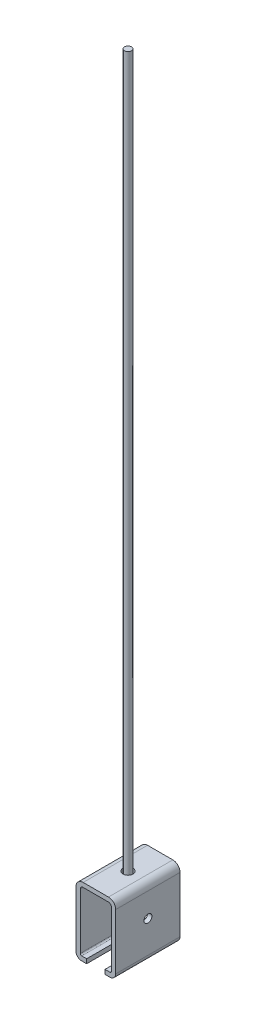
ISO-10303-21;
HEADER;
FILE_DESCRIPTION(('STEP AP214'),'2;1');
FILE_NAME('part.step','',(''),(''),'','','');
FILE_SCHEMA(('AUTOMOTIVE_DESIGN { 1 0 10303 214 1 1 1 1 }'));
ENDSEC;
DATA;
#1=APPLICATION_CONTEXT('core data for automotive mechanical design processes');
#2=APPLICATION_PROTOCOL_DEFINITION('international standard','automotive_design',2000,#1);
#3=PRODUCT_CONTEXT('',#1,'mechanical');
#4=PRODUCT('Part','Part','',(#3));
#5=PRODUCT_RELATED_PRODUCT_CATEGORY('part','',(#4));
#6=PRODUCT_DEFINITION_FORMATION('','',#4);
#7=PRODUCT_DEFINITION_CONTEXT('part definition',#1,'design');
#8=PRODUCT_DEFINITION('design','',#6,#7);
#9=PRODUCT_DEFINITION_SHAPE('','',#8);
#10=(LENGTH_UNIT() NAMED_UNIT(*) SI_UNIT(.MILLI.,.METRE.));
#11=(NAMED_UNIT(*) PLANE_ANGLE_UNIT() SI_UNIT($,.RADIAN.));
#12=(NAMED_UNIT(*) SI_UNIT($,.STERADIAN.) SOLID_ANGLE_UNIT());
#13=UNCERTAINTY_MEASURE_WITH_UNIT(LENGTH_MEASURE(1.E-05),#10,'distance_accuracy_value','');
#14=(GEOMETRIC_REPRESENTATION_CONTEXT(3) GLOBAL_UNCERTAINTY_ASSIGNED_CONTEXT((#13)) GLOBAL_UNIT_ASSIGNED_CONTEXT((#10,
#11,#12)) REPRESENTATION_CONTEXT('',''));
#15=CARTESIAN_POINT('',(0.,0.,0.));
#16=DIRECTION('',(0.,0.,1.));
#17=DIRECTION('',(1.,0.,0.));
#18=AXIS2_PLACEMENT_3D('',#15,#16,#17);
#19=CARTESIAN_POINT('',(0.,76.2999999999998,44.5));
#20=DIRECTION('',(0.,1.,0.));
#21=DIRECTION('',(-1.,0.,0.));
#22=AXIS2_PLACEMENT_3D('',#19,#20,#21);
#23=CYLINDRICAL_SURFACE('',#22,4.7625);
#24=CARTESIAN_POINT('',(0.,76.2999999999998,44.5));
#25=DIRECTION('',(0.,-1.,0.));
#26=DIRECTION('',(1.,0.,0.));
#27=AXIS2_PLACEMENT_3D('',#24,#25,#26);
#28=CIRCLE('',#27,4.7625);
#29=CARTESIAN_POINT('',(4.7625,76.2999999999998,44.5));
#30=VERTEX_POINT('',#29);
#31=EDGE_CURVE('P0_E10',#30,#30,#28,.T.);
#32=ORIENTED_EDGE('',*,*,#31,.F.);
#33=EDGE_LOOP('',(#32));
#34=FACE_BOUND('',#33,.T.);
#35=CARTESIAN_POINT('',(1.33226762955019E-12,1079.6,44.5));
#36=DIRECTION('',(0.,-1.,0.));
#37=DIRECTION('',(1.,0.,0.));
#38=AXIS2_PLACEMENT_3D('',#35,#36,#37);
#39=CIRCLE('',#38,4.7625);
#40=CARTESIAN_POINT('',(4.76250000000133,1079.6,44.5));
#41=VERTEX_POINT('',#40);
#42=EDGE_CURVE('P0_E36',#41,#41,#39,.T.);
#43=ORIENTED_EDGE('',*,*,#42,.T.);
#44=EDGE_LOOP('',(#43));
#45=FACE_BOUND('',#44,.T.);
#46=ADVANCED_FACE('P0_F30',(#34,#45),#23,.T.);
#47=CARTESIAN_POINT('',(0.,76.2999999999998,44.5));
#48=DIRECTION('',(0.,-1.,0.));
#49=DIRECTION('',(1.,0.,0.));
#50=AXIS2_PLACEMENT_3D('',#47,#48,#49);
#51=PLANE('',#50);
#52=ORIENTED_EDGE('',*,*,#31,.T.);
#53=EDGE_LOOP('',(#52));
#54=FACE_BOUND('',#53,.T.);
#55=ADVANCED_FACE('P0_F45',(#54),#51,.T.);
#56=CARTESIAN_POINT('',(1.33226762955019E-12,1079.6,44.5));
#57=DIRECTION('',(0.,-1.,0.));
#58=DIRECTION('',(1.,0.,0.));
#59=AXIS2_PLACEMENT_3D('',#56,#57,#58);
#60=PLANE('',#59);
#61=ORIENTED_EDGE('',*,*,#42,.F.);
#62=EDGE_LOOP('',(#61));
#63=FACE_BOUND('',#62,.T.);
#64=ADVANCED_FACE('P0_F43',(#63),#60,.F.);
#65=CLOSED_SHELL('',(#46,#55,#64));
#66=MANIFOLD_SOLID_BREP('P0_B2',#65);
#67=CARTESIAN_POINT('',(-27.5,52.,44.5000000000001));
#68=DIRECTION('',(-1.,0.,0.));
#69=DIRECTION('',(0.,-1.,0.));
#70=AXIS2_PLACEMENT_3D('',#67,#68,#69);
#71=CYLINDRICAL_SURFACE('',#70,5.5);
#72=CARTESIAN_POINT('',(-27.5,52.,44.5000000000001));
#73=DIRECTION('',(-1.,0.,0.));
#74=DIRECTION('',(0.,-1.,0.));
#75=AXIS2_PLACEMENT_3D('',#72,#73,#74);
#76=CIRCLE('',#75,5.5);
#77=CARTESIAN_POINT('',(-27.5,46.5,44.5000000000001));
#78=VERTEX_POINT('',#77);
#79=EDGE_CURVE('P1_E207',#78,#78,#76,.F.);
#80=ORIENTED_EDGE('',*,*,#79,.F.);
#81=EDGE_LOOP('',(#80));
#82=FACE_BOUND('',#81,.T.);
#83=CARTESIAN_POINT('',(-21.5,52.,44.5000000000001));
#84=DIRECTION('',(-1.,0.,0.));
#85=DIRECTION('',(0.,-1.,0.));
#86=AXIS2_PLACEMENT_3D('',#83,#84,#85);
#87=CIRCLE('',#86,5.5);
#88=CARTESIAN_POINT('',(-21.5,46.5,44.5000000000001));
#89=VERTEX_POINT('',#88);
#90=EDGE_CURVE('P1_E203',#89,#89,#87,.T.);
#91=ORIENTED_EDGE('',*,*,#90,.F.);
#92=EDGE_LOOP('',(#91));
#93=FACE_BOUND('',#92,.T.);
#94=ADVANCED_FACE('P1_F17',(#82,#93),#71,.F.);
#95=CARTESIAN_POINT('',(-19.5000000000001,7.99999999999995,44.5000000000001));
#96=DIRECTION('',(0.,0.,-1.));
#97=DIRECTION('',(-1.,0.,0.));
#98=AXIS2_PLACEMENT_3D('',#95,#96,#97);
#99=CYLINDRICAL_SURFACE('',#98,2.);
#100=CARTESIAN_POINT('',(-19.5000000000001,7.99999999999995,0.));
#101=DIRECTION('',(0.,0.,-1.));
#102=DIRECTION('',(-1.,0.,0.));
#103=AXIS2_PLACEMENT_3D('',#100,#101,#102);
#104=CIRCLE('',#103,2.);
#105=CARTESIAN_POINT('',(-21.5000000000001,7.99999999999995,0.));
#106=VERTEX_POINT('',#105);
#107=CARTESIAN_POINT('',(-19.5000000000001,5.99999999999995,0.));
#108=VERTEX_POINT('',#107);
#109=EDGE_CURVE('P1_E216',#106,#108,#104,.F.);
#110=ORIENTED_EDGE('',*,*,#109,.F.);
#111=DIRECTION('',(0.,0.,1.));
#112=VECTOR('',#111,1.);
#113=CARTESIAN_POINT('',(-21.5000000000001,7.99999999999995,44.5000000000001));
#114=LINE('',#113,#112);
#115=CARTESIAN_POINT('',(-21.5000000000001,7.99999999999995,89.0000000000001));
#116=VERTEX_POINT('',#115);
#117=EDGE_CURVE('P1_E206',#116,#106,#114,.F.);
#118=ORIENTED_EDGE('',*,*,#117,.F.);
#119=CARTESIAN_POINT('',(-19.5000000000001,7.99999999999995,89.0000000000001));
#120=DIRECTION('',(0.,0.,-1.));
#121=DIRECTION('',(-1.,0.,0.));
#122=AXIS2_PLACEMENT_3D('',#119,#120,#121);
#123=CIRCLE('',#122,2.);
#124=CARTESIAN_POINT('',(-19.5000000000001,5.99999999999995,89.0000000000001));
#125=VERTEX_POINT('',#124);
#126=EDGE_CURVE('P1_E20',#125,#116,#123,.T.);
#127=ORIENTED_EDGE('',*,*,#126,.F.);
#128=DIRECTION('',(0.,0.,1.));
#129=VECTOR('',#128,1.);
#130=CARTESIAN_POINT('',(-19.5000000000001,5.99999999999996,44.5000000000001));
#131=LINE('',#130,#129);
#132=EDGE_CURVE('P1_E310',#108,#125,#131,.T.);
#133=ORIENTED_EDGE('',*,*,#132,.F.);
#134=EDGE_LOOP('',(#110,#118,#127,#133));
#135=FACE_BOUND('',#134,.T.);
#136=ADVANCED_FACE('P1_F229',(#135),#99,.F.);
#137=CARTESIAN_POINT('',(0.,88.9999999999998,44.5000000000001));
#138=DIRECTION('',(0.,-1.,0.));
#139=DIRECTION('',(1.,0.,0.));
#140=AXIS2_PLACEMENT_3D('',#137,#138,#139);
#141=CYLINDRICAL_SURFACE('',#140,6.99999999999999);
#142=CARTESIAN_POINT('',(0.,95.,44.5000000000001));
#143=DIRECTION('',(0.,-1.,0.));
#144=DIRECTION('',(1.,0.,0.));
#145=AXIS2_PLACEMENT_3D('',#142,#143,#144);
#146=CIRCLE('',#145,6.99999999999999);
#147=CARTESIAN_POINT('',(6.99999999999999,95.,44.5000000000001));
#148=VERTEX_POINT('',#147);
#149=EDGE_CURVE('P1_E164',#148,#148,#146,.T.);
#150=ORIENTED_EDGE('',*,*,#149,.F.);
#151=EDGE_LOOP('',(#150));
#152=FACE_BOUND('',#151,.T.);
#153=CARTESIAN_POINT('',(0.,88.9999999999999,44.5000000000001));
#154=DIRECTION('',(0.,-1.,0.));
#155=DIRECTION('',(1.,0.,0.));
#156=AXIS2_PLACEMENT_3D('',#153,#154,#155);
#157=CIRCLE('',#156,6.99999999999999);
#158=CARTESIAN_POINT('',(6.99999999999998,88.9999999999998,44.5000000000001));
#159=VERTEX_POINT('',#158);
#160=EDGE_CURVE('P1_E198',#159,#159,#157,.F.);
#161=ORIENTED_EDGE('',*,*,#160,.F.);
#162=EDGE_LOOP('',(#161));
#163=FACE_BOUND('',#162,.T.);
#164=ADVANCED_FACE('P1_F593',(#152,#163),#141,.F.);
#165=CARTESIAN_POINT('',(19.4999999999999,7.99999999999993,44.5000000000001));
#166=DIRECTION('',(0.,0.,-1.));
#167=DIRECTION('',(-1.,0.,0.));
#168=AXIS2_PLACEMENT_3D('',#165,#166,#167);
#169=CYLINDRICAL_SURFACE('',#168,2.);
#170=CARTESIAN_POINT('',(19.4999999999999,7.99999999999993,89.0000000000001));
#171=DIRECTION('',(0.,0.,-1.));
#172=DIRECTION('',(-1.,0.,0.));
#173=AXIS2_PLACEMENT_3D('',#170,#171,#172);
#174=CIRCLE('',#173,2.);
#175=CARTESIAN_POINT('',(21.4999999999999,7.99999999999993,89.0000000000001));
#176=VERTEX_POINT('',#175);
#177=CARTESIAN_POINT('',(19.4999999999999,5.99999999999993,89.0000000000001));
#178=VERTEX_POINT('',#177);
#179=EDGE_CURVE('P1_E213',#176,#178,#174,.T.);
#180=ORIENTED_EDGE('',*,*,#179,.F.);
#181=DIRECTION('',(0.,0.,1.));
#182=VECTOR('',#181,1.);
#183=CARTESIAN_POINT('',(21.4999999999999,7.99999999999992,44.5000000000001));
#184=LINE('',#183,#182);
#185=CARTESIAN_POINT('',(21.4999999999999,7.99999999999993,0.));
#186=VERTEX_POINT('',#185);
#187=EDGE_CURVE('P1_E285',#186,#176,#184,.T.);
#188=ORIENTED_EDGE('',*,*,#187,.F.);
#189=CARTESIAN_POINT('',(19.4999999999999,7.99999999999993,0.));
#190=DIRECTION('',(0.,0.,-1.));
#191=DIRECTION('',(-1.,0.,0.));
#192=AXIS2_PLACEMENT_3D('',#189,#190,#191);
#193=CIRCLE('',#192,2.);
#194=CARTESIAN_POINT('',(19.4999999999999,5.99999999999993,0.));
#195=VERTEX_POINT('',#194);
#196=EDGE_CURVE('P1_E215',#195,#186,#193,.F.);
#197=ORIENTED_EDGE('',*,*,#196,.F.);
#198=DIRECTION('',(0.,0.,1.));
#199=VECTOR('',#198,1.);
#200=CARTESIAN_POINT('',(19.4999999999999,5.99999999999993,44.5000000000001));
#201=LINE('',#200,#199);
#202=EDGE_CURVE('P1_E297',#178,#195,#201,.F.);
#203=ORIENTED_EDGE('',*,*,#202,.F.);
#204=EDGE_LOOP('',(#180,#188,#197,#203));
#205=FACE_BOUND('',#204,.T.);
#206=ADVANCED_FACE('P1_F584',(#205),#169,.F.);
#207=CARTESIAN_POINT('',(27.5,95.,44.5000000000001));
#208=DIRECTION('',(0.,1.,0.));
#209=DIRECTION('',(-1.,0.,0.));
#210=AXIS2_PLACEMENT_3D('',#207,#208,#209);
#211=PLANE('',#210);
#212=DIRECTION('',(0.,0.,1.));
#213=VECTOR('',#212,1.);
#214=CARTESIAN_POINT('',(17.5,95.,44.5000000000001));
#215=LINE('',#214,#213);
#216=CARTESIAN_POINT('',(17.5,95.,89.0000000000001));
#217=VERTEX_POINT('',#216);
#218=CARTESIAN_POINT('',(17.5,95.,0.));
#219=VERTEX_POINT('',#218);
#220=EDGE_CURVE('P1_E156',#217,#219,#215,.F.);
#221=ORIENTED_EDGE('',*,*,#220,.T.);
#222=DIRECTION('',(1.,0.,0.));
#223=VECTOR('',#222,1.);
#224=CARTESIAN_POINT('',(0.,95.,0.));
#225=LINE('',#224,#223);
#226=CARTESIAN_POINT('',(-17.5,94.9999999999999,0.));
#227=VERTEX_POINT('',#226);
#228=EDGE_CURVE('P1_E197',#219,#227,#225,.F.);
#229=ORIENTED_EDGE('',*,*,#228,.T.);
#230=DIRECTION('',(0.,0.,-1.));
#231=VECTOR('',#230,1.);
#232=CARTESIAN_POINT('',(-17.5,94.9999999999998,44.5000000000001));
#233=LINE('',#232,#231);
#234=CARTESIAN_POINT('',(-17.5,94.9999999999999,89.0000000000001));
#235=VERTEX_POINT('',#234);
#236=EDGE_CURVE('P1_E163',#235,#227,#233,.T.);
#237=ORIENTED_EDGE('',*,*,#236,.F.);
#238=DIRECTION('',(1.,0.,0.));
#239=VECTOR('',#238,1.);
#240=CARTESIAN_POINT('',(0.,95.,89.0000000000001));
#241=LINE('',#240,#239);
#242=EDGE_CURVE('P1_E167',#217,#235,#241,.F.);
#243=ORIENTED_EDGE('',*,*,#242,.F.);
#244=EDGE_LOOP('',(#221,#229,#237,#243));
#245=FACE_BOUND('',#244,.T.);
#246=ORIENTED_EDGE('',*,*,#149,.T.);
#247=EDGE_LOOP('',(#246));
#248=FACE_BOUND('',#247,.T.);
#249=ADVANCED_FACE('P1_F168',(#245,#248),#211,.T.);
#250=CARTESIAN_POINT('',(-17.5,84.9999999999998,44.5000000000001));
#251=DIRECTION('',(0.,0.,-1.));
#252=DIRECTION('',(-1.,0.,0.));
#253=AXIS2_PLACEMENT_3D('',#250,#251,#252);
#254=CYLINDRICAL_SURFACE('',#253,10.);
#255=DIRECTION('',(0.,0.,1.));
#256=VECTOR('',#255,1.);
#257=CARTESIAN_POINT('',(-27.5,84.9999999999998,44.5000000000001));
#258=LINE('',#257,#256);
#259=CARTESIAN_POINT('',(-27.5,84.9999999999998,89.0000000000001));
#260=VERTEX_POINT('',#259);
#261=CARTESIAN_POINT('',(-27.5,84.9999999999998,0.));
#262=VERTEX_POINT('',#261);
#263=EDGE_CURVE('P1_E210',#260,#262,#258,.F.);
#264=ORIENTED_EDGE('',*,*,#263,.F.);
#265=CARTESIAN_POINT('',(-17.5,84.9999999999998,89.0000000000001));
#266=DIRECTION('',(0.,0.,-1.));
#267=DIRECTION('',(-1.,0.,0.));
#268=AXIS2_PLACEMENT_3D('',#265,#266,#267);
#269=CIRCLE('',#268,10.);
#270=EDGE_CURVE('P1_E153',#235,#260,#269,.F.);
#271=ORIENTED_EDGE('',*,*,#270,.F.);
#272=ORIENTED_EDGE('',*,*,#236,.T.);
#273=CARTESIAN_POINT('',(-17.5,84.9999999999998,0.));
#274=DIRECTION('',(0.,0.,-1.));
#275=DIRECTION('',(-1.,0.,0.));
#276=AXIS2_PLACEMENT_3D('',#273,#274,#275);
#277=CIRCLE('',#276,10.);
#278=EDGE_CURVE('P1_E195',#227,#262,#277,.F.);
#279=ORIENTED_EDGE('',*,*,#278,.T.);
#280=EDGE_LOOP('',(#264,#271,#272,#279));
#281=FACE_BOUND('',#280,.T.);
#282=ADVANCED_FACE('P1_F567',(#281),#254,.T.);
#283=CARTESIAN_POINT('',(-27.5,95.,44.5000000000001));
#284=DIRECTION('',(-1.,0.,0.));
#285=DIRECTION('',(0.,-1.,0.));
#286=AXIS2_PLACEMENT_3D('',#283,#284,#285);
#287=PLANE('',#286);
#288=ORIENTED_EDGE('',*,*,#263,.T.);
#289=DIRECTION('',(0.,1.,0.));
#290=VECTOR('',#289,1.);
#291=CARTESIAN_POINT('',(-27.5,50.8643803585347,0.));
#292=LINE('',#291,#290);
#293=CARTESIAN_POINT('',(-27.5,7.99999999999998,0.));
#294=VERTEX_POINT('',#293);
#295=EDGE_CURVE('P1_E194',#262,#294,#292,.F.);
#296=ORIENTED_EDGE('',*,*,#295,.T.);
#297=DIRECTION('',(0.,0.,-1.));
#298=VECTOR('',#297,1.);
#299=CARTESIAN_POINT('',(-27.5000000000001,7.99999999999998,44.5000000000001));
#300=LINE('',#299,#298);
#301=CARTESIAN_POINT('',(-27.5,7.99999999999998,89.0000000000001));
#302=VERTEX_POINT('',#301);
#303=EDGE_CURVE('P1_E320',#302,#294,#300,.T.);
#304=ORIENTED_EDGE('',*,*,#303,.F.);
#305=DIRECTION('',(0.,1.,0.));
#306=VECTOR('',#305,1.);
#307=CARTESIAN_POINT('',(-27.5,50.8643803585347,89.0000000000001));
#308=LINE('',#307,#306);
#309=EDGE_CURVE('P1_E250',#260,#302,#308,.F.);
#310=ORIENTED_EDGE('',*,*,#309,.F.);
#311=EDGE_LOOP('',(#288,#296,#304,#310));
#312=FACE_BOUND('',#311,.T.);
#313=ORIENTED_EDGE('',*,*,#79,.T.);
#314=EDGE_LOOP('',(#313));
#315=FACE_BOUND('',#314,.T.);
#316=ADVANCED_FACE('P1_F343',(#312,#315),#287,.T.);
#317=CARTESIAN_POINT('',(-19.5000000000001,7.99999999999998,44.5000000000001));
#318=DIRECTION('',(0.,0.,-1.));
#319=DIRECTION('',(-1.,0.,0.));
#320=AXIS2_PLACEMENT_3D('',#317,#318,#319);
#321=CYLINDRICAL_SURFACE('',#320,8.);
#322=DIRECTION('',(0.,0.,1.));
#323=VECTOR('',#322,1.);
#324=CARTESIAN_POINT('',(-19.5000000000001,0.,44.5000000000001));
#325=LINE('',#324,#323);
#326=CARTESIAN_POINT('',(-19.5000000000001,0.,89.0000000000001));
#327=VERTEX_POINT('',#326);
#328=CARTESIAN_POINT('',(-19.5000000000001,0.,0.));
#329=VERTEX_POINT('',#328);
#330=EDGE_CURVE('P1_E317',#327,#329,#325,.F.);
#331=ORIENTED_EDGE('',*,*,#330,.F.);
#332=CARTESIAN_POINT('',(-19.5000000000001,7.99999999999998,89.0000000000001));
#333=DIRECTION('',(0.,0.,-1.));
#334=DIRECTION('',(-1.,0.,0.));
#335=AXIS2_PLACEMENT_3D('',#332,#333,#334);
#336=CIRCLE('',#335,8.);
#337=EDGE_CURVE('P1_E249',#302,#327,#336,.F.);
#338=ORIENTED_EDGE('',*,*,#337,.F.);
#339=ORIENTED_EDGE('',*,*,#303,.T.);
#340=CARTESIAN_POINT('',(-19.5000000000001,7.99999999999998,0.));
#341=DIRECTION('',(0.,0.,-1.));
#342=DIRECTION('',(-1.,0.,0.));
#343=AXIS2_PLACEMENT_3D('',#340,#341,#342);
#344=CIRCLE('',#343,8.);
#345=EDGE_CURVE('P1_E191',#294,#329,#344,.F.);
#346=ORIENTED_EDGE('',*,*,#345,.T.);
#347=EDGE_LOOP('',(#331,#338,#339,#346));
#348=FACE_BOUND('',#347,.T.);
#349=ADVANCED_FACE('P1_F341',(#348),#321,.T.);
#350=CARTESIAN_POINT('',(-27.5,0.,44.5000000000001));
#351=DIRECTION('',(0.,-1.,0.));
#352=DIRECTION('',(1.,0.,0.));
#353=AXIS2_PLACEMENT_3D('',#350,#351,#352);
#354=PLANE('',#353);
#355=DIRECTION('',(0.,0.,1.));
#356=VECTOR('',#355,1.);
#357=CARTESIAN_POINT('',(-12.7000000000001,0.,44.5000000000001));
#358=LINE('',#357,#356);
#359=CARTESIAN_POINT('',(-12.7000000000001,0.,89.0000000000001));
#360=VERTEX_POINT('',#359);
#361=CARTESIAN_POINT('',(-12.7000000000001,0.,0.));
#362=VERTEX_POINT('',#361);
#363=EDGE_CURVE('P1_E312',#360,#362,#358,.F.);
#364=ORIENTED_EDGE('',*,*,#363,.F.);
#365=DIRECTION('',(1.,0.,0.));
#366=VECTOR('',#365,1.);
#367=CARTESIAN_POINT('',(0.,0.,89.0000000000001));
#368=LINE('',#367,#366);
#369=EDGE_CURVE('P1_E246',#327,#360,#368,.T.);
#370=ORIENTED_EDGE('',*,*,#369,.F.);
#371=ORIENTED_EDGE('',*,*,#330,.T.);
#372=DIRECTION('',(1.,0.,0.));
#373=VECTOR('',#372,1.);
#374=CARTESIAN_POINT('',(0.,0.,0.));
#375=LINE('',#374,#373);
#376=EDGE_CURVE('P1_E193',#329,#362,#375,.T.);
#377=ORIENTED_EDGE('',*,*,#376,.T.);
#378=EDGE_LOOP('',(#364,#370,#371,#377));
#379=FACE_BOUND('',#378,.T.);
#380=ADVANCED_FACE('P1_F351',(#379),#354,.T.);
#381=CARTESIAN_POINT('',(-12.7000000000001,0.,44.5000000000001));
#382=DIRECTION('',(1.,0.,0.));
#383=DIRECTION('',(0.,1.,0.));
#384=AXIS2_PLACEMENT_3D('',#381,#382,#383);
#385=PLANE('',#384);
#386=DIRECTION('',(0.,1.,0.));
#387=VECTOR('',#386,1.);
#388=CARTESIAN_POINT('',(-12.7000000000001,50.8643803585347,89.0000000000001));
#389=LINE('',#388,#387);
#390=CARTESIAN_POINT('',(-12.7000000000001,5.99999999999995,89.0000000000001));
#391=VERTEX_POINT('',#390);
#392=EDGE_CURVE('P1_E241',#360,#391,#389,.T.);
#393=ORIENTED_EDGE('',*,*,#392,.F.);
#394=ORIENTED_EDGE('',*,*,#363,.T.);
#395=DIRECTION('',(0.,1.,0.));
#396=VECTOR('',#395,1.);
#397=CARTESIAN_POINT('',(-12.7000000000001,50.8643803585347,0.));
#398=LINE('',#397,#396);
#399=CARTESIAN_POINT('',(-12.7000000000001,5.99999999999995,0.));
#400=VERTEX_POINT('',#399);
#401=EDGE_CURVE('P1_E276',#362,#400,#398,.T.);
#402=ORIENTED_EDGE('',*,*,#401,.T.);
#403=DIRECTION('',(0.,0.,1.));
#404=VECTOR('',#403,1.);
#405=CARTESIAN_POINT('',(-12.7000000000001,5.99999999999995,44.5000000000001));
#406=LINE('',#405,#404);
#407=EDGE_CURVE('P1_E117',#391,#400,#406,.F.);
#408=ORIENTED_EDGE('',*,*,#407,.F.);
#409=EDGE_LOOP('',(#393,#394,#402,#408));
#410=FACE_BOUND('',#409,.T.);
#411=ADVANCED_FACE('P1_F352',(#410),#385,.T.);
#412=CARTESIAN_POINT('',(-12.7000000000001,5.99999999999995,44.5000000000001));
#413=DIRECTION('',(0.,1.,0.));
#414=DIRECTION('',(-1.,0.,0.));
#415=AXIS2_PLACEMENT_3D('',#412,#413,#414);
#416=PLANE('',#415);
#417=ORIENTED_EDGE('',*,*,#407,.T.);
#418=DIRECTION('',(1.,0.,0.));
#419=VECTOR('',#418,1.);
#420=CARTESIAN_POINT('',(0.,5.99999999999995,0.));
#421=LINE('',#420,#419);
#422=EDGE_CURVE('P1_E273',#400,#108,#421,.F.);
#423=ORIENTED_EDGE('',*,*,#422,.T.);
#424=ORIENTED_EDGE('',*,*,#132,.T.);
#425=DIRECTION('',(1.,0.,0.));
#426=VECTOR('',#425,1.);
#427=CARTESIAN_POINT('',(0.,5.99999999999995,89.0000000000001));
#428=LINE('',#427,#426);
#429=EDGE_CURVE('P1_E227',#391,#125,#428,.F.);
#430=ORIENTED_EDGE('',*,*,#429,.F.);
#431=EDGE_LOOP('',(#417,#423,#424,#430));
#432=FACE_BOUND('',#431,.T.);
#433=ADVANCED_FACE('P1_F354',(#432),#416,.T.);
#434=CARTESIAN_POINT('',(-21.5000000000001,5.99999999999995,44.5000000000001));
#435=DIRECTION('',(1.,0.,0.));
#436=DIRECTION('',(0.,1.,0.));
#437=AXIS2_PLACEMENT_3D('',#434,#435,#436);
#438=PLANE('',#437);
#439=DIRECTION('',(0.,0.,-1.));
#440=VECTOR('',#439,1.);
#441=CARTESIAN_POINT('',(-21.5,84.9999999999998,44.5000000000001));
#442=LINE('',#441,#440);
#443=CARTESIAN_POINT('',(-21.5000000000001,84.9999999999998,0.));
#444=VERTEX_POINT('',#443);
#445=CARTESIAN_POINT('',(-21.5,84.9999999999998,89.0000000000001));
#446=VERTEX_POINT('',#445);
#447=EDGE_CURVE('P1_E202',#444,#446,#442,.F.);
#448=ORIENTED_EDGE('',*,*,#447,.T.);
#449=DIRECTION('',(0.,1.,0.));
#450=VECTOR('',#449,1.);
#451=CARTESIAN_POINT('',(-21.5000000000001,50.8643803585347,89.0000000000001));
#452=LINE('',#451,#450);
#453=EDGE_CURVE('P1_E225',#116,#446,#452,.T.);
#454=ORIENTED_EDGE('',*,*,#453,.F.);
#455=ORIENTED_EDGE('',*,*,#117,.T.);
#456=DIRECTION('',(0.,1.,0.));
#457=VECTOR('',#456,1.);
#458=CARTESIAN_POINT('',(-21.5000000000001,50.8643803585347,0.));
#459=LINE('',#458,#457);
#460=EDGE_CURVE('P1_E190',#106,#444,#459,.T.);
#461=ORIENTED_EDGE('',*,*,#460,.T.);
#462=EDGE_LOOP('',(#448,#454,#455,#461));
#463=FACE_BOUND('',#462,.T.);
#464=ORIENTED_EDGE('',*,*,#90,.T.);
#465=EDGE_LOOP('',(#464));
#466=FACE_BOUND('',#465,.T.);
#467=ADVANCED_FACE('P1_F234',(#463,#466),#438,.T.);
#468=CARTESIAN_POINT('',(-17.5,84.9999999999998,44.5000000000001));
#469=DIRECTION('',(0.,0.,-1.));
#470=DIRECTION('',(-1.,0.,0.));
#471=AXIS2_PLACEMENT_3D('',#468,#469,#470);
#472=CYLINDRICAL_SURFACE('',#471,4.);
#473=CARTESIAN_POINT('',(-17.5,84.9999999999998,0.));
#474=DIRECTION('',(0.,0.,-1.));
#475=DIRECTION('',(-1.,0.,0.));
#476=AXIS2_PLACEMENT_3D('',#473,#474,#475);
#477=CIRCLE('',#476,4.);
#478=CARTESIAN_POINT('',(-17.5,88.9999999999998,0.));
#479=VERTEX_POINT('',#478);
#480=EDGE_CURVE('P1_E188',#444,#479,#477,.T.);
#481=ORIENTED_EDGE('',*,*,#480,.T.);
#482=DIRECTION('',(0.,0.,1.));
#483=VECTOR('',#482,1.);
#484=CARTESIAN_POINT('',(-17.5,88.9999999999998,44.5000000000001));
#485=LINE('',#484,#483);
#486=CARTESIAN_POINT('',(-17.5,88.9999999999998,89.0000000000001));
#487=VERTEX_POINT('',#486);
#488=EDGE_CURVE('P1_E201',#487,#479,#485,.F.);
#489=ORIENTED_EDGE('',*,*,#488,.F.);
#490=CARTESIAN_POINT('',(-17.5,84.9999999999998,89.0000000000001));
#491=DIRECTION('',(0.,0.,-1.));
#492=DIRECTION('',(-1.,0.,0.));
#493=AXIS2_PLACEMENT_3D('',#490,#491,#492);
#494=CIRCLE('',#493,4.);
#495=EDGE_CURVE('P1_E237',#446,#487,#494,.T.);
#496=ORIENTED_EDGE('',*,*,#495,.F.);
#497=ORIENTED_EDGE('',*,*,#447,.F.);
#498=EDGE_LOOP('',(#481,#489,#496,#497));
#499=FACE_BOUND('',#498,.T.);
#500=ADVANCED_FACE('P1_F409',(#499),#472,.F.);
#501=CARTESIAN_POINT('',(-21.5,88.9999999999998,44.5000000000001));
#502=DIRECTION('',(0.,-1.,0.));
#503=DIRECTION('',(1.,0.,0.));
#504=AXIS2_PLACEMENT_3D('',#501,#502,#503);
#505=PLANE('',#504);
#506=DIRECTION('',(0.,0.,-1.));
#507=VECTOR('',#506,1.);
#508=CARTESIAN_POINT('',(17.5,88.9999999999998,44.5000000000001));
#509=LINE('',#508,#507);
#510=CARTESIAN_POINT('',(17.5,88.9999999999998,0.));
#511=VERTEX_POINT('',#510);
#512=CARTESIAN_POINT('',(17.5,88.9999999999998,89.0000000000001));
#513=VERTEX_POINT('',#512);
#514=EDGE_CURVE('P1_E300',#511,#513,#509,.F.);
#515=ORIENTED_EDGE('',*,*,#514,.T.);
#516=DIRECTION('',(1.,0.,0.));
#517=VECTOR('',#516,1.);
#518=CARTESIAN_POINT('',(0.,88.9999999999998,89.0000000000001));
#519=LINE('',#518,#517);
#520=EDGE_CURVE('P1_E239',#487,#513,#519,.T.);
#521=ORIENTED_EDGE('',*,*,#520,.F.);
#522=ORIENTED_EDGE('',*,*,#488,.T.);
#523=DIRECTION('',(1.,0.,0.));
#524=VECTOR('',#523,1.);
#525=CARTESIAN_POINT('',(0.,88.9999999999998,0.));
#526=LINE('',#525,#524);
#527=EDGE_CURVE('P1_E187',#479,#511,#526,.T.);
#528=ORIENTED_EDGE('',*,*,#527,.T.);
#529=EDGE_LOOP('',(#515,#521,#522,#528));
#530=FACE_BOUND('',#529,.T.);
#531=ORIENTED_EDGE('',*,*,#160,.T.);
#532=EDGE_LOOP('',(#531));
#533=FACE_BOUND('',#532,.T.);
#534=ADVANCED_FACE('P1_F405',(#530,#533),#505,.T.);
#535=CARTESIAN_POINT('',(17.5,84.9999999999998,44.5000000000001));
#536=DIRECTION('',(0.,0.,-1.));
#537=DIRECTION('',(-1.,0.,0.));
#538=AXIS2_PLACEMENT_3D('',#535,#536,#537);
#539=CYLINDRICAL_SURFACE('',#538,4.);
#540=CARTESIAN_POINT('',(17.5,84.9999999999998,0.));
#541=DIRECTION('',(0.,0.,-1.));
#542=DIRECTION('',(-1.,0.,0.));
#543=AXIS2_PLACEMENT_3D('',#540,#541,#542);
#544=CIRCLE('',#543,4.);
#545=CARTESIAN_POINT('',(21.5,84.9999999999998,0.));
#546=VERTEX_POINT('',#545);
#547=EDGE_CURVE('P1_E184',#511,#546,#544,.T.);
#548=ORIENTED_EDGE('',*,*,#547,.T.);
#549=DIRECTION('',(0.,0.,1.));
#550=VECTOR('',#549,1.);
#551=CARTESIAN_POINT('',(21.5,84.9999999999998,44.5000000000001));
#552=LINE('',#551,#550);
#553=CARTESIAN_POINT('',(21.5,84.9999999999998,89.0000000000001));
#554=VERTEX_POINT('',#553);
#555=EDGE_CURVE('P1_E281',#554,#546,#552,.F.);
#556=ORIENTED_EDGE('',*,*,#555,.F.);
#557=CARTESIAN_POINT('',(17.5,84.9999999999998,89.0000000000001));
#558=DIRECTION('',(0.,0.,-1.));
#559=DIRECTION('',(-1.,0.,0.));
#560=AXIS2_PLACEMENT_3D('',#557,#558,#559);
#561=CIRCLE('',#560,4.);
#562=EDGE_CURVE('P1_E333',#513,#554,#561,.T.);
#563=ORIENTED_EDGE('',*,*,#562,.F.);
#564=ORIENTED_EDGE('',*,*,#514,.F.);
#565=EDGE_LOOP('',(#548,#556,#563,#564));
#566=FACE_BOUND('',#565,.T.);
#567=ADVANCED_FACE('P1_F401',(#566),#539,.F.);
#568=CARTESIAN_POINT('',(21.4999999999999,5.99999999999993,44.5000000000001));
#569=DIRECTION('',(0.,1.,0.));
#570=DIRECTION('',(-1.,0.,0.));
#571=AXIS2_PLACEMENT_3D('',#568,#569,#570);
#572=PLANE('',#571);
#573=DIRECTION('',(0.,0.,1.));
#574=VECTOR('',#573,1.);
#575=CARTESIAN_POINT('',(12.6999999999999,5.99999999999993,44.5000000000001));
#576=LINE('',#575,#574);
#577=CARTESIAN_POINT('',(12.6999999999999,5.99999999999993,89.0000000000001));
#578=VERTEX_POINT('',#577);
#579=CARTESIAN_POINT('',(12.6999999999999,5.99999999999993,0.));
#580=VERTEX_POINT('',#579);
#581=EDGE_CURVE('P1_E289',#578,#580,#576,.F.);
#582=ORIENTED_EDGE('',*,*,#581,.F.);
#583=DIRECTION('',(1.,0.,0.));
#584=VECTOR('',#583,1.);
#585=CARTESIAN_POINT('',(0.,5.99999999999993,89.0000000000001));
#586=LINE('',#585,#584);
#587=EDGE_CURVE('P1_E294',#178,#578,#586,.F.);
#588=ORIENTED_EDGE('',*,*,#587,.F.);
#589=ORIENTED_EDGE('',*,*,#202,.T.);
#590=DIRECTION('',(1.,0.,0.));
#591=VECTOR('',#590,1.);
#592=CARTESIAN_POINT('',(0.,5.99999999999993,0.));
#593=LINE('',#592,#591);
#594=EDGE_CURVE('P1_E265',#195,#580,#593,.F.);
#595=ORIENTED_EDGE('',*,*,#594,.T.);
#596=EDGE_LOOP('',(#582,#588,#589,#595));
#597=FACE_BOUND('',#596,.T.);
#598=ADVANCED_FACE('P1_F397',(#597),#572,.T.);
#599=CARTESIAN_POINT('',(12.6999999999999,5.99999999999993,44.5000000000001));
#600=DIRECTION('',(-1.,0.,0.));
#601=DIRECTION('',(0.,-1.,0.));
#602=AXIS2_PLACEMENT_3D('',#599,#600,#601);
#603=PLANE('',#602);
#604=DIRECTION('',(0.,1.,0.));
#605=VECTOR('',#604,1.);
#606=CARTESIAN_POINT('',(12.6999999999999,50.8643803585347,89.0000000000001));
#607=LINE('',#606,#605);
#608=CARTESIAN_POINT('',(12.6999999999999,0.,89.0000000000001));
#609=VERTEX_POINT('',#608);
#610=EDGE_CURVE('P1_E290',#578,#609,#607,.F.);
#611=ORIENTED_EDGE('',*,*,#610,.F.);
#612=ORIENTED_EDGE('',*,*,#581,.T.);
#613=DIRECTION('',(0.,1.,0.));
#614=VECTOR('',#613,1.);
#615=CARTESIAN_POINT('',(12.6999999999999,50.8643803585347,0.));
#616=LINE('',#615,#614);
#617=CARTESIAN_POINT('',(12.6999999999999,0.,0.));
#618=VERTEX_POINT('',#617);
#619=EDGE_CURVE('P1_E264',#580,#618,#616,.F.);
#620=ORIENTED_EDGE('',*,*,#619,.T.);
#621=DIRECTION('',(0.,0.,1.));
#622=VECTOR('',#621,1.);
#623=CARTESIAN_POINT('',(12.6999999999999,0.,44.5000000000001));
#624=LINE('',#623,#622);
#625=EDGE_CURVE('P1_E286',#609,#618,#624,.F.);
#626=ORIENTED_EDGE('',*,*,#625,.F.);
#627=EDGE_LOOP('',(#611,#612,#620,#626));
#628=FACE_BOUND('',#627,.T.);
#629=ADVANCED_FACE('P1_F393',(#628),#603,.T.);
#630=CARTESIAN_POINT('',(12.6999999999999,0.,44.5000000000001));
#631=DIRECTION('',(0.,-1.,0.));
#632=DIRECTION('',(1.,0.,0.));
#633=AXIS2_PLACEMENT_3D('',#630,#631,#632);
#634=PLANE('',#633);
#635=ORIENTED_EDGE('',*,*,#625,.T.);
#636=DIRECTION('',(1.,0.,0.));
#637=VECTOR('',#636,1.);
#638=CARTESIAN_POINT('',(0.,0.,0.));
#639=LINE('',#638,#637);
#640=CARTESIAN_POINT('',(19.4999999999999,0.,0.));
#641=VERTEX_POINT('',#640);
#642=EDGE_CURVE('P1_E183',#618,#641,#639,.T.);
#643=ORIENTED_EDGE('',*,*,#642,.T.);
#644=DIRECTION('',(0.,0.,-1.));
#645=VECTOR('',#644,1.);
#646=CARTESIAN_POINT('',(19.4999999999999,0.,44.5000000000001));
#647=LINE('',#646,#645);
#648=CARTESIAN_POINT('',(19.4999999999999,0.,89.0000000000001));
#649=VERTEX_POINT('',#648);
#650=EDGE_CURVE('P1_E282',#649,#641,#647,.T.);
#651=ORIENTED_EDGE('',*,*,#650,.F.);
#652=DIRECTION('',(1.,0.,0.));
#653=VECTOR('',#652,1.);
#654=CARTESIAN_POINT('',(0.,0.,89.0000000000001));
#655=LINE('',#654,#653);
#656=EDGE_CURVE('P1_E293',#609,#649,#655,.T.);
#657=ORIENTED_EDGE('',*,*,#656,.F.);
#658=EDGE_LOOP('',(#635,#643,#651,#657));
#659=FACE_BOUND('',#658,.T.);
#660=ADVANCED_FACE('P1_F389',(#659),#634,.T.);
#661=CARTESIAN_POINT('',(21.5,88.9999999999998,44.5000000000001));
#662=DIRECTION('',(-1.,0.,0.));
#663=DIRECTION('',(0.,-1.,0.));
#664=AXIS2_PLACEMENT_3D('',#661,#662,#663);
#665=PLANE('',#664);
#666=CARTESIAN_POINT('',(21.5,52.,44.5));
#667=DIRECTION('',(-1.,0.,0.));
#668=DIRECTION('',(0.,-1.,0.));
#669=AXIS2_PLACEMENT_3D('',#666,#667,#668);
#670=CIRCLE('',#669,5.5);
#671=CARTESIAN_POINT('',(21.4999999999999,46.5,44.5));
#672=VERTEX_POINT('',#671);
#673=EDGE_CURVE('P1_E260',#672,#672,#670,.F.);
#674=ORIENTED_EDGE('',*,*,#673,.T.);
#675=EDGE_LOOP('',(#674));
#676=FACE_BOUND('',#675,.T.);
#677=ORIENTED_EDGE('',*,*,#555,.T.);
#678=DIRECTION('',(0.,1.,0.));
#679=VECTOR('',#678,1.);
#680=CARTESIAN_POINT('',(21.5,50.8643803585347,0.));
#681=LINE('',#680,#679);
#682=EDGE_CURVE('P1_E186',#546,#186,#681,.F.);
#683=ORIENTED_EDGE('',*,*,#682,.T.);
#684=ORIENTED_EDGE('',*,*,#187,.T.);
#685=DIRECTION('',(0.,1.,0.));
#686=VECTOR('',#685,1.);
#687=CARTESIAN_POINT('',(21.5,50.8643803585347,89.0000000000001));
#688=LINE('',#687,#686);
#689=EDGE_CURVE('P1_E335',#554,#176,#688,.F.);
#690=ORIENTED_EDGE('',*,*,#689,.F.);
#691=EDGE_LOOP('',(#677,#683,#684,#690));
#692=FACE_BOUND('',#691,.T.);
#693=ADVANCED_FACE('P1_F385',(#676,#692),#665,.T.);
#694=CARTESIAN_POINT('',(19.4999999999999,7.99999999999993,44.5000000000001));
#695=DIRECTION('',(0.,0.,-1.));
#696=DIRECTION('',(-1.,0.,0.));
#697=AXIS2_PLACEMENT_3D('',#694,#695,#696);
#698=CYLINDRICAL_SURFACE('',#697,8.);
#699=DIRECTION('',(0.,0.,1.));
#700=VECTOR('',#699,1.);
#701=CARTESIAN_POINT('',(27.5,7.99999999999993,44.5000000000001));
#702=LINE('',#701,#700);
#703=CARTESIAN_POINT('',(27.5,7.99999999999992,89.0000000000001));
#704=VERTEX_POINT('',#703);
#705=CARTESIAN_POINT('',(27.5,7.99999999999992,0.));
#706=VERTEX_POINT('',#705);
#707=EDGE_CURVE('P1_E257',#704,#706,#702,.F.);
#708=ORIENTED_EDGE('',*,*,#707,.F.);
#709=CARTESIAN_POINT('',(19.4999999999999,7.99999999999993,89.0000000000001));
#710=DIRECTION('',(0.,0.,-1.));
#711=DIRECTION('',(-1.,0.,0.));
#712=AXIS2_PLACEMENT_3D('',#709,#710,#711);
#713=CIRCLE('',#712,8.);
#714=EDGE_CURVE('P1_E331',#649,#704,#713,.F.);
#715=ORIENTED_EDGE('',*,*,#714,.F.);
#716=ORIENTED_EDGE('',*,*,#650,.T.);
#717=CARTESIAN_POINT('',(19.4999999999999,7.99999999999993,0.));
#718=DIRECTION('',(0.,0.,-1.));
#719=DIRECTION('',(-1.,0.,0.));
#720=AXIS2_PLACEMENT_3D('',#717,#718,#719);
#721=CIRCLE('',#720,8.);
#722=EDGE_CURVE('P1_E177',#641,#706,#721,.F.);
#723=ORIENTED_EDGE('',*,*,#722,.T.);
#724=EDGE_LOOP('',(#708,#715,#716,#723));
#725=FACE_BOUND('',#724,.T.);
#726=ADVANCED_FACE('P1_F382',(#725),#698,.T.);
#727=CARTESIAN_POINT('',(0.,50.8643803585347,0.));
#728=DIRECTION('',(0.,0.,1.));
#729=DIRECTION('',(1.,0.,0.));
#730=AXIS2_PLACEMENT_3D('',#727,#728,#729);
#731=PLANE('',#730);
#732=ORIENTED_EDGE('',*,*,#642,.F.);
#733=ORIENTED_EDGE('',*,*,#619,.F.);
#734=ORIENTED_EDGE('',*,*,#594,.F.);
#735=ORIENTED_EDGE('',*,*,#196,.T.);
#736=ORIENTED_EDGE('',*,*,#682,.F.);
#737=ORIENTED_EDGE('',*,*,#547,.F.);
#738=ORIENTED_EDGE('',*,*,#527,.F.);
#739=ORIENTED_EDGE('',*,*,#480,.F.);
#740=ORIENTED_EDGE('',*,*,#460,.F.);
#741=ORIENTED_EDGE('',*,*,#109,.T.);
#742=ORIENTED_EDGE('',*,*,#422,.F.);
#743=ORIENTED_EDGE('',*,*,#401,.F.);
#744=ORIENTED_EDGE('',*,*,#376,.F.);
#745=ORIENTED_EDGE('',*,*,#345,.F.);
#746=ORIENTED_EDGE('',*,*,#295,.F.);
#747=ORIENTED_EDGE('',*,*,#278,.F.);
#748=ORIENTED_EDGE('',*,*,#228,.F.);
#749=CARTESIAN_POINT('',(17.5,84.9999999999998,0.));
#750=DIRECTION('',(0.,0.,1.));
#751=DIRECTION('',(1.,0.,0.));
#752=AXIS2_PLACEMENT_3D('',#749,#750,#751);
#753=CIRCLE('',#752,10.);
#754=CARTESIAN_POINT('',(27.5000000000001,84.9999999999998,0.));
#755=VERTEX_POINT('',#754);
#756=EDGE_CURVE('P1_E159',#755,#219,#753,.T.);
#757=ORIENTED_EDGE('',*,*,#756,.F.);
#758=DIRECTION('',(0.,1.,0.));
#759=VECTOR('',#758,1.);
#760=CARTESIAN_POINT('',(27.5,0.,0.));
#761=LINE('',#760,#759);
#762=EDGE_CURVE('P1_E255',#706,#755,#761,.T.);
#763=ORIENTED_EDGE('',*,*,#762,.F.);
#764=ORIENTED_EDGE('',*,*,#722,.F.);
#765=EDGE_LOOP('',(#732,#733,#734,#735,#736,#737,#738,#739,#740,#741,#742,#743,#744,#745,#746,
#747,#748,#757,#763,#764));
#766=FACE_BOUND('',#765,.T.);
#767=ADVANCED_FACE('P1_F347',(#766),#731,.F.);
#768=CARTESIAN_POINT('',(17.5,84.9999999999998,44.5000000000001));
#769=DIRECTION('',(0.,0.,1.));
#770=DIRECTION('',(1.,0.,0.));
#771=AXIS2_PLACEMENT_3D('',#768,#769,#770);
#772=CYLINDRICAL_SURFACE('',#771,10.);
#773=DIRECTION('',(0.,0.,1.));
#774=VECTOR('',#773,1.);
#775=CARTESIAN_POINT('',(27.5000000000001,84.9999999999998,44.5000000000001));
#776=LINE('',#775,#774);
#777=CARTESIAN_POINT('',(27.5000000000001,84.9999999999998,89.0000000000001));
#778=VERTEX_POINT('',#777);
#779=EDGE_CURVE('P1_E253',#755,#778,#776,.T.);
#780=ORIENTED_EDGE('',*,*,#779,.F.);
#781=ORIENTED_EDGE('',*,*,#756,.T.);
#782=ORIENTED_EDGE('',*,*,#220,.F.);
#783=CARTESIAN_POINT('',(17.5,84.9999999999998,89.0000000000001));
#784=DIRECTION('',(0.,0.,1.));
#785=DIRECTION('',(1.,0.,0.));
#786=AXIS2_PLACEMENT_3D('',#783,#784,#785);
#787=CIRCLE('',#786,10.);
#788=EDGE_CURVE('P1_E35',#778,#217,#787,.T.);
#789=ORIENTED_EDGE('',*,*,#788,.F.);
#790=EDGE_LOOP('',(#780,#781,#782,#789));
#791=FACE_BOUND('',#790,.T.);
#792=ADVANCED_FACE('P1_F158',(#791),#772,.T.);
#793=CARTESIAN_POINT('',(0.,50.8643803585347,89.0000000000001));
#794=DIRECTION('',(0.,0.,1.));
#795=DIRECTION('',(1.,0.,0.));
#796=AXIS2_PLACEMENT_3D('',#793,#794,#795);
#797=PLANE('',#796);
#798=ORIENTED_EDGE('',*,*,#656,.T.);
#799=ORIENTED_EDGE('',*,*,#714,.T.);
#800=DIRECTION('',(0.,1.,0.));
#801=VECTOR('',#800,1.);
#802=CARTESIAN_POINT('',(27.5,0.,89.0000000000001));
#803=LINE('',#802,#801);
#804=EDGE_CURVE('P1_E26',#778,#704,#803,.F.);
#805=ORIENTED_EDGE('',*,*,#804,.F.);
#806=ORIENTED_EDGE('',*,*,#788,.T.);
#807=ORIENTED_EDGE('',*,*,#242,.T.);
#808=ORIENTED_EDGE('',*,*,#270,.T.);
#809=ORIENTED_EDGE('',*,*,#309,.T.);
#810=ORIENTED_EDGE('',*,*,#337,.T.);
#811=ORIENTED_EDGE('',*,*,#369,.T.);
#812=ORIENTED_EDGE('',*,*,#392,.T.);
#813=ORIENTED_EDGE('',*,*,#429,.T.);
#814=ORIENTED_EDGE('',*,*,#126,.T.);
#815=ORIENTED_EDGE('',*,*,#453,.T.);
#816=ORIENTED_EDGE('',*,*,#495,.T.);
#817=ORIENTED_EDGE('',*,*,#520,.T.);
#818=ORIENTED_EDGE('',*,*,#562,.T.);
#819=ORIENTED_EDGE('',*,*,#689,.T.);
#820=ORIENTED_EDGE('',*,*,#179,.T.);
#821=ORIENTED_EDGE('',*,*,#587,.T.);
#822=ORIENTED_EDGE('',*,*,#610,.T.);
#823=EDGE_LOOP('',(#798,#799,#805,#806,#807,#808,#809,#810,#811,#812,#813,#814,#815,#816,#817,
#818,#819,#820,#821,#822));
#824=FACE_BOUND('',#823,.T.);
#825=ADVANCED_FACE('P1_F173',(#824),#797,.T.);
#826=CARTESIAN_POINT('',(-27.5,52.,44.5000000000001));
#827=DIRECTION('',(-1.,0.,0.));
#828=DIRECTION('',(0.,-1.,0.));
#829=AXIS2_PLACEMENT_3D('',#826,#827,#828);
#830=CYLINDRICAL_SURFACE('',#829,5.5);
#831=ORIENTED_EDGE('',*,*,#673,.F.);
#832=EDGE_LOOP('',(#831));
#833=FACE_BOUND('',#832,.T.);
#834=CARTESIAN_POINT('',(27.5,52.,44.5));
#835=DIRECTION('',(-1.,0.,0.));
#836=DIRECTION('',(0.,-1.,0.));
#837=AXIS2_PLACEMENT_3D('',#834,#835,#836);
#838=CIRCLE('',#837,5.5);
#839=CARTESIAN_POINT('',(27.5,46.5,44.5));
#840=VERTEX_POINT('',#839);
#841=EDGE_CURVE('P1_E11',#840,#840,#838,.T.);
#842=ORIENTED_EDGE('',*,*,#841,.F.);
#843=EDGE_LOOP('',(#842));
#844=FACE_BOUND('',#843,.T.);
#845=ADVANCED_FACE('P1_F366',(#833,#844),#830,.F.);
#846=CARTESIAN_POINT('',(27.5,0.,44.5000000000001));
#847=DIRECTION('',(1.,0.,0.));
#848=DIRECTION('',(0.,1.,0.));
#849=AXIS2_PLACEMENT_3D('',#846,#847,#848);
#850=PLANE('',#849);
#851=ORIENTED_EDGE('',*,*,#841,.T.);
#852=EDGE_LOOP('',(#851));
#853=FACE_BOUND('',#852,.T.);
#854=ORIENTED_EDGE('',*,*,#779,.T.);
#855=ORIENTED_EDGE('',*,*,#804,.T.);
#856=ORIENTED_EDGE('',*,*,#707,.T.);
#857=ORIENTED_EDGE('',*,*,#762,.T.);
#858=EDGE_LOOP('',(#854,#855,#856,#857));
#859=FACE_BOUND('',#858,.T.);
#860=ADVANCED_FACE('P1_F364',(#853,#859),#850,.T.);
#861=CLOSED_SHELL('',(#94,#136,#164,#206,#249,#282,#316,#349,#380,#411,#433,#467,#500,#534,#567,
#598,#629,#660,#693,#726,#767,#792,#825,#845,#860));
#862=MANIFOLD_SOLID_BREP('P1_B1',#861);
#863=ADVANCED_BREP_SHAPE_REPRESENTATION('',(#18,#66,#862),#14);
#864=SHAPE_DEFINITION_REPRESENTATION(#9,#863);
ENDSEC;
END-ISO-10303-21;
